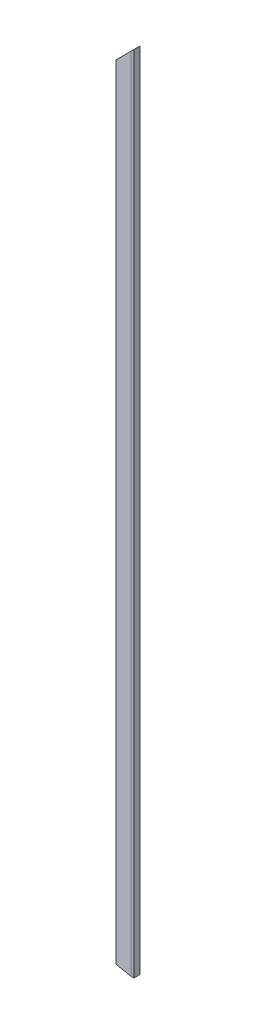
ISO-10303-21;
HEADER;
FILE_DESCRIPTION(('STEP AP214'),'2;1');
FILE_NAME('part.step','',(''),(''),'','','');
FILE_SCHEMA(('AUTOMOTIVE_DESIGN { 1 0 10303 214 1 1 1 1 }'));
ENDSEC;
DATA;
#1=APPLICATION_CONTEXT('core data for automotive mechanical design processes');
#2=APPLICATION_PROTOCOL_DEFINITION('international standard','automotive_design',2000,#1);
#3=PRODUCT_CONTEXT('',#1,'mechanical');
#4=PRODUCT('Part','Part','',(#3));
#5=PRODUCT_RELATED_PRODUCT_CATEGORY('part','',(#4));
#6=PRODUCT_DEFINITION_FORMATION('','',#4);
#7=PRODUCT_DEFINITION_CONTEXT('part definition',#1,'design');
#8=PRODUCT_DEFINITION('design','',#6,#7);
#9=PRODUCT_DEFINITION_SHAPE('','',#8);
#10=(LENGTH_UNIT() NAMED_UNIT(*) SI_UNIT(.MILLI.,.METRE.));
#11=(NAMED_UNIT(*) PLANE_ANGLE_UNIT() SI_UNIT($,.RADIAN.));
#12=(NAMED_UNIT(*) SI_UNIT($,.STERADIAN.) SOLID_ANGLE_UNIT());
#13=UNCERTAINTY_MEASURE_WITH_UNIT(LENGTH_MEASURE(1.E-05),#10,'distance_accuracy_value','');
#14=(GEOMETRIC_REPRESENTATION_CONTEXT(3) GLOBAL_UNCERTAINTY_ASSIGNED_CONTEXT((#13)) GLOBAL_UNIT_ASSIGNED_CONTEXT((#10,
#11,#12)) REPRESENTATION_CONTEXT('',''));
#15=CARTESIAN_POINT('',(0.,0.,0.));
#16=DIRECTION('',(0.,0.,1.));
#17=DIRECTION('',(1.,0.,0.));
#18=AXIS2_PLACEMENT_3D('',#15,#16,#17);
#19=CARTESIAN_POINT('',(0.,2092.325,8.255));
#20=DIRECTION('',(1.,0.,0.));
#21=DIRECTION('',(0.,0.,-1.));
#22=AXIS2_PLACEMENT_3D('',#19,#20,#21);
#23=PLANE('',#22);
#24=DIRECTION('',(0.,-1.,0.));
#25=VECTOR('',#24,1.);
#26=CARTESIAN_POINT('',(0.,2092.325,8.255));
#27=LINE('',#26,#25);
#28=CARTESIAN_POINT('',(0.,2038.35,8.255));
#29=VERTEX_POINT('',#28);
#30=CARTESIAN_POINT('',(0.,0.,8.255));
#31=VERTEX_POINT('',#30);
#32=EDGE_CURVE('E11',#29,#31,#27,.T.);
#33=ORIENTED_EDGE('',*,*,#32,.F.);
#34=DIRECTION('',(0.,0.,1.));
#35=VECTOR('',#34,1.);
#36=CARTESIAN_POINT('',(0.,2038.35,0.));
#37=LINE('',#36,#35);
#38=CARTESIAN_POINT('',(0.,2038.35,0.));
#39=VERTEX_POINT('',#38);
#40=EDGE_CURVE('E119',#39,#29,#37,.T.);
#41=ORIENTED_EDGE('',*,*,#40,.F.);
#42=DIRECTION('',(0.,-1.,0.));
#43=VECTOR('',#42,1.);
#44=CARTESIAN_POINT('',(0.,2092.325,0.));
#45=LINE('',#44,#43);
#46=CARTESIAN_POINT('',(0.,0.,0.));
#47=VERTEX_POINT('',#46);
#48=EDGE_CURVE('E92',#39,#47,#45,.T.);
#49=ORIENTED_EDGE('',*,*,#48,.T.);
#50=DIRECTION('',(0.,0.,1.));
#51=VECTOR('',#50,1.);
#52=CARTESIAN_POINT('',(0.,0.,8.255));
#53=LINE('',#52,#51);
#54=EDGE_CURVE('E97',#47,#31,#53,.T.);
#55=ORIENTED_EDGE('',*,*,#54,.T.);
#56=EDGE_LOOP('',(#33,#41,#49,#55));
#57=FACE_BOUND('',#56,.T.);
#58=ADVANCED_FACE('F36',(#57),#23,.F.);
#59=CARTESIAN_POINT('',(46.355,2092.325,15.875));
#60=DIRECTION('',(0.162206600298323,0.,-0.986756818481464));
#61=DIRECTION('',(-0.986756818481464,0.,-0.162206600298323));
#62=AXIS2_PLACEMENT_3D('',#59,#60,#61);
#63=PLANE('',#62);
#64=DIRECTION('',(0.,-1.,0.));
#65=VECTOR('',#64,1.);
#66=CARTESIAN_POINT('',(46.355,2092.325,15.875));
#67=LINE('',#66,#65);
#68=CARTESIAN_POINT('',(46.355,2084.705,15.875));
#69=VERTEX_POINT('',#68);
#70=CARTESIAN_POINT('',(46.355,0.,15.875));
#71=VERTEX_POINT('',#70);
#72=EDGE_CURVE('E44',#69,#71,#67,.T.);
#73=ORIENTED_EDGE('',*,*,#72,.F.);
#74=DIRECTION('',(-0.702377795543571,-0.702377795543581,-0.115459363650998));
#75=VECTOR('',#74,1.);
#76=CARTESIAN_POINT('',(50.1142094056657,2088.46420940567,16.4929522310683));
#77=LINE('',#76,#75);
#78=EDGE_CURVE('E116',#69,#29,#77,.T.);
#79=ORIENTED_EDGE('',*,*,#78,.T.);
#80=ORIENTED_EDGE('',*,*,#32,.T.);
#81=DIRECTION('',(0.986756818481464,0.,0.162206600298323));
#82=VECTOR('',#81,1.);
#83=CARTESIAN_POINT('',(46.355,0.,15.875));
#84=LINE('',#83,#82);
#85=EDGE_CURVE('E111',#31,#71,#84,.T.);
#86=ORIENTED_EDGE('',*,*,#85,.T.);
#87=EDGE_LOOP('',(#73,#79,#80,#86));
#88=FACE_BOUND('',#87,.T.);
#89=ADVANCED_FACE('F112',(#88),#63,.F.);
#90=CARTESIAN_POINT('',(53.975,2092.325,15.875));
#91=DIRECTION('',(0.,0.,-1.));
#92=DIRECTION('',(-1.,0.,0.));
#93=AXIS2_PLACEMENT_3D('',#90,#91,#92);
#94=PLANE('',#93);
#95=DIRECTION('',(0.,-1.,0.));
#96=VECTOR('',#95,1.);
#97=CARTESIAN_POINT('',(53.975,2092.325,15.875));
#98=LINE('',#97,#96);
#99=CARTESIAN_POINT('',(53.975,2092.325,15.875));
#100=VERTEX_POINT('',#99);
#101=CARTESIAN_POINT('',(53.975,0.,15.875));
#102=VERTEX_POINT('',#101);
#103=EDGE_CURVE('E77',#100,#102,#98,.T.);
#104=ORIENTED_EDGE('',*,*,#103,.F.);
#105=DIRECTION('',(0.707106781186542,0.707106781186553,0.));
#106=VECTOR('',#105,1.);
#107=CARTESIAN_POINT('',(53.975,2092.325,15.875));
#108=LINE('',#107,#106);
#109=EDGE_CURVE('E51',#69,#100,#108,.T.);
#110=ORIENTED_EDGE('',*,*,#109,.F.);
#111=ORIENTED_EDGE('',*,*,#72,.T.);
#112=DIRECTION('',(1.,0.,0.));
#113=VECTOR('',#112,1.);
#114=CARTESIAN_POINT('',(53.975,0.,15.875));
#115=LINE('',#114,#113);
#116=EDGE_CURVE('E82',#71,#102,#115,.T.);
#117=ORIENTED_EDGE('',*,*,#116,.T.);
#118=EDGE_LOOP('',(#104,#110,#111,#117));
#119=FACE_BOUND('',#118,.T.);
#120=ADVANCED_FACE('F107',(#119),#94,.F.);
#121=CARTESIAN_POINT('',(53.975,2092.325,0.));
#122=DIRECTION('',(-1.,0.,0.));
#123=DIRECTION('',(0.,0.,1.));
#124=AXIS2_PLACEMENT_3D('',#121,#122,#123);
#125=PLANE('',#124);
#126=DIRECTION('',(0.,0.,-1.));
#127=VECTOR('',#126,1.);
#128=CARTESIAN_POINT('',(53.975,0.,0.));
#129=LINE('',#128,#127);
#130=CARTESIAN_POINT('',(53.975,0.,0.));
#131=VERTEX_POINT('',#130);
#132=EDGE_CURVE('E71',#102,#131,#129,.T.);
#133=ORIENTED_EDGE('',*,*,#132,.T.);
#134=DIRECTION('',(0.,-1.,0.));
#135=VECTOR('',#134,1.);
#136=CARTESIAN_POINT('',(53.975,2092.325,0.));
#137=LINE('',#136,#135);
#138=CARTESIAN_POINT('',(53.975,2092.325,0.));
#139=VERTEX_POINT('',#138);
#140=EDGE_CURVE('E76',#139,#131,#137,.T.);
#141=ORIENTED_EDGE('',*,*,#140,.F.);
#142=DIRECTION('',(0.,0.,-1.));
#143=VECTOR('',#142,1.);
#144=CARTESIAN_POINT('',(53.975,2092.325,0.));
#145=LINE('',#144,#143);
#146=EDGE_CURVE('E98',#100,#139,#145,.T.);
#147=ORIENTED_EDGE('',*,*,#146,.F.);
#148=ORIENTED_EDGE('',*,*,#103,.T.);
#149=EDGE_LOOP('',(#133,#141,#147,#148));
#150=FACE_BOUND('',#149,.T.);
#151=ADVANCED_FACE('F73',(#150),#125,.F.);
#152=CARTESIAN_POINT('',(0.,2092.325,0.));
#153=DIRECTION('',(0.,0.,1.));
#154=DIRECTION('',(1.,0.,0.));
#155=AXIS2_PLACEMENT_3D('',#152,#153,#154);
#156=PLANE('',#155);
#157=ORIENTED_EDGE('',*,*,#48,.F.);
#158=DIRECTION('',(0.707106781186542,0.707106781186553,0.));
#159=VECTOR('',#158,1.);
#160=CARTESIAN_POINT('',(53.975,2092.325,0.));
#161=LINE('',#160,#159);
#162=EDGE_CURVE('E91',#39,#139,#161,.T.);
#163=ORIENTED_EDGE('',*,*,#162,.T.);
#164=ORIENTED_EDGE('',*,*,#140,.T.);
#165=DIRECTION('',(-1.,0.,0.));
#166=VECTOR('',#165,1.);
#167=CARTESIAN_POINT('',(0.,0.,0.));
#168=LINE('',#167,#166);
#169=EDGE_CURVE('E81',#131,#47,#168,.T.);
#170=ORIENTED_EDGE('',*,*,#169,.T.);
#171=EDGE_LOOP('',(#157,#163,#164,#170));
#172=FACE_BOUND('',#171,.T.);
#173=ADVANCED_FACE('F88',(#172),#156,.F.);
#174=CARTESIAN_POINT('',(0.,0.,0.));
#175=DIRECTION('',(0.,-1.,0.));
#176=DIRECTION('',(0.,0.,-1.));
#177=AXIS2_PLACEMENT_3D('',#174,#175,#176);
#178=PLANE('',#177);
#179=ORIENTED_EDGE('',*,*,#54,.F.);
#180=ORIENTED_EDGE('',*,*,#169,.F.);
#181=ORIENTED_EDGE('',*,*,#132,.F.);
#182=ORIENTED_EDGE('',*,*,#116,.F.);
#183=ORIENTED_EDGE('',*,*,#85,.F.);
#184=EDGE_LOOP('',(#179,#180,#181,#182,#183));
#185=FACE_BOUND('',#184,.T.);
#186=ADVANCED_FACE('F94',(#185),#178,.T.);
#187=CARTESIAN_POINT('',(53.975,2092.325,0.));
#188=DIRECTION('',(0.707106781186553,-0.707106781186542,0.));
#189=DIRECTION('',(0.707106781186542,0.707106781186553,0.));
#190=AXIS2_PLACEMENT_3D('',#187,#188,#189);
#191=PLANE('',#190);
#192=ORIENTED_EDGE('',*,*,#109,.T.);
#193=ORIENTED_EDGE('',*,*,#146,.T.);
#194=ORIENTED_EDGE('',*,*,#162,.F.);
#195=ORIENTED_EDGE('',*,*,#40,.T.);
#196=ORIENTED_EDGE('',*,*,#78,.F.);
#197=EDGE_LOOP('',(#192,#193,#194,#195,#196));
#198=FACE_BOUND('',#197,.T.);
#199=ADVANCED_FACE('F124',(#198),#191,.F.);
#200=CLOSED_SHELL('',(#58,#89,#120,#151,#173,#186,#199));
#201=MANIFOLD_SOLID_BREP('B2',#200);
#202=ADVANCED_BREP_SHAPE_REPRESENTATION('',(#18,#201),#14);
#203=SHAPE_DEFINITION_REPRESENTATION(#9,#202);
ENDSEC;
END-ISO-10303-21;
